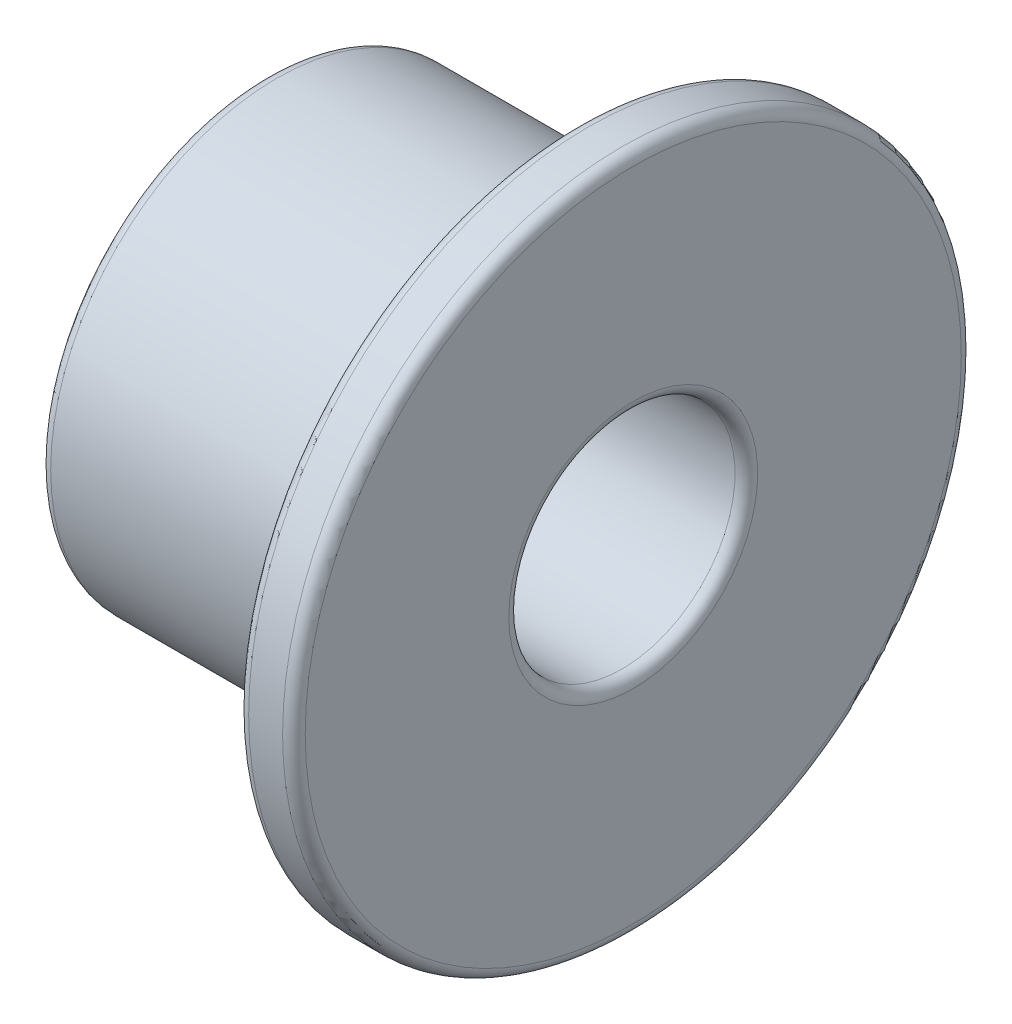
ISO-10303-21;
HEADER;
FILE_DESCRIPTION(('STEP AP214'),'2;1');
FILE_NAME('part.step','',(''),(''),'','','');
FILE_SCHEMA(('AUTOMOTIVE_DESIGN { 1 0 10303 214 1 1 1 1 }'));
ENDSEC;
DATA;
#1=APPLICATION_CONTEXT('core data for automotive mechanical design processes');
#2=APPLICATION_PROTOCOL_DEFINITION('international standard','automotive_design',2000,#1);
#3=PRODUCT_CONTEXT('',#1,'mechanical');
#4=PRODUCT('Part','Part','',(#3));
#5=PRODUCT_RELATED_PRODUCT_CATEGORY('part','',(#4));
#6=PRODUCT_DEFINITION_FORMATION('','',#4);
#7=PRODUCT_DEFINITION_CONTEXT('part definition',#1,'design');
#8=PRODUCT_DEFINITION('design','',#6,#7);
#9=PRODUCT_DEFINITION_SHAPE('','',#8);
#10=(LENGTH_UNIT() NAMED_UNIT(*) SI_UNIT(.MILLI.,.METRE.));
#11=(NAMED_UNIT(*) PLANE_ANGLE_UNIT() SI_UNIT($,.RADIAN.));
#12=(NAMED_UNIT(*) SI_UNIT($,.STERADIAN.) SOLID_ANGLE_UNIT());
#13=UNCERTAINTY_MEASURE_WITH_UNIT(LENGTH_MEASURE(1.E-05),#10,'distance_accuracy_value','');
#14=(GEOMETRIC_REPRESENTATION_CONTEXT(3) GLOBAL_UNCERTAINTY_ASSIGNED_CONTEXT((#13)) GLOBAL_UNIT_ASSIGNED_CONTEXT((#10,
#11,#12)) REPRESENTATION_CONTEXT('',''));
#15=CARTESIAN_POINT('',(0.,0.,0.));
#16=DIRECTION('',(0.,0.,1.));
#17=DIRECTION('',(1.,0.,0.));
#18=AXIS2_PLACEMENT_3D('',#15,#16,#17);
#19=CARTESIAN_POINT('',(0.,4.,0.));
#20=DIRECTION('',(1.,0.,0.));
#21=DIRECTION('',(0.,0.,-1.));
#22=AXIS2_PLACEMENT_3D('',#19,#20,#21);
#23=PLANE('',#22);
#24=CARTESIAN_POINT('',(0.,0.,0.));
#25=DIRECTION('',(1.,0.,0.));
#26=DIRECTION('',(0.,0.,-1.));
#27=AXIS2_PLACEMENT_3D('',#24,#25,#26);
#28=CIRCLE('',#27,2.2);
#29=CARTESIAN_POINT('',(0.,0.,-2.2));
#30=VERTEX_POINT('',#29);
#31=EDGE_CURVE('E62',#30,#30,#28,.T.);
#32=ORIENTED_EDGE('',*,*,#31,.T.);
#33=EDGE_LOOP('',(#32));
#34=FACE_BOUND('',#33,.T.);
#35=CARTESIAN_POINT('',(0.,0.,0.));
#36=DIRECTION('',(1.,0.,0.));
#37=DIRECTION('',(0.,0.,-1.));
#38=AXIS2_PLACEMENT_3D('',#35,#36,#37);
#39=CIRCLE('',#38,3.8);
#40=CARTESIAN_POINT('',(0.,0.,-3.8));
#41=VERTEX_POINT('',#40);
#42=EDGE_CURVE('E65',#41,#41,#39,.F.);
#43=ORIENTED_EDGE('',*,*,#42,.T.);
#44=EDGE_LOOP('',(#43));
#45=FACE_BOUND('',#44,.T.);
#46=ADVANCED_FACE('F31',(#34,#45),#23,.F.);
#47=CARTESIAN_POINT('',(0.,0.,0.));
#48=DIRECTION('',(-1.,0.,0.));
#49=DIRECTION('',(0.,0.,1.));
#50=AXIS2_PLACEMENT_3D('',#47,#48,#49);
#51=CYLINDRICAL_SURFACE('',#50,4.);
#52=CARTESIAN_POINT('',(5.3,0.,0.));
#53=DIRECTION('',(1.,0.,0.));
#54=DIRECTION('',(0.,0.,-1.));
#55=AXIS2_PLACEMENT_3D('',#52,#53,#54);
#56=CIRCLE('',#55,4.);
#57=CARTESIAN_POINT('',(5.3,0.,-4.));
#58=VERTEX_POINT('',#57);
#59=EDGE_CURVE('E50',#58,#58,#56,.F.);
#60=ORIENTED_EDGE('',*,*,#59,.T.);
#61=EDGE_LOOP('',(#60));
#62=FACE_BOUND('',#61,.T.);
#63=CARTESIAN_POINT('',(0.2,0.,0.));
#64=DIRECTION('',(1.,0.,0.));
#65=DIRECTION('',(0.,0.,-1.));
#66=AXIS2_PLACEMENT_3D('',#63,#64,#65);
#67=CIRCLE('',#66,4.);
#68=CARTESIAN_POINT('',(0.2,0.,-4.));
#69=VERTEX_POINT('',#68);
#70=EDGE_CURVE('E53',#69,#69,#67,.T.);
#71=ORIENTED_EDGE('',*,*,#70,.T.);
#72=EDGE_LOOP('',(#71));
#73=FACE_BOUND('',#72,.T.);
#74=ADVANCED_FACE('F107',(#62,#73),#51,.T.);
#75=CARTESIAN_POINT('',(5.5,6.,0.));
#76=DIRECTION('',(1.,0.,0.));
#77=DIRECTION('',(0.,0.,-1.));
#78=AXIS2_PLACEMENT_3D('',#75,#76,#77);
#79=PLANE('',#78);
#80=CARTESIAN_POINT('',(5.5,0.,0.));
#81=DIRECTION('',(1.,0.,0.));
#82=DIRECTION('',(0.,0.,-1.));
#83=AXIS2_PLACEMENT_3D('',#80,#81,#82);
#84=CIRCLE('',#83,4.2);
#85=CARTESIAN_POINT('',(5.5,0.,-4.2));
#86=VERTEX_POINT('',#85);
#87=EDGE_CURVE('E41',#86,#86,#84,.T.);
#88=ORIENTED_EDGE('',*,*,#87,.T.);
#89=EDGE_LOOP('',(#88));
#90=FACE_BOUND('',#89,.T.);
#91=CARTESIAN_POINT('',(5.5,0.,0.));
#92=DIRECTION('',(1.,0.,0.));
#93=DIRECTION('',(0.,0.,-1.));
#94=AXIS2_PLACEMENT_3D('',#91,#92,#93);
#95=CIRCLE('',#94,5.8);
#96=CARTESIAN_POINT('',(5.5,0.,-5.8));
#97=VERTEX_POINT('',#96);
#98=EDGE_CURVE('E45',#97,#97,#95,.F.);
#99=ORIENTED_EDGE('',*,*,#98,.T.);
#100=EDGE_LOOP('',(#99));
#101=FACE_BOUND('',#100,.T.);
#102=ADVANCED_FACE('F112',(#90,#101),#79,.F.);
#103=CARTESIAN_POINT('',(0.,0.,0.));
#104=DIRECTION('',(-1.,0.,0.));
#105=DIRECTION('',(0.,0.,1.));
#106=AXIS2_PLACEMENT_3D('',#103,#104,#105);
#107=CYLINDRICAL_SURFACE('',#106,6.);
#108=CARTESIAN_POINT('',(6.3,0.,0.));
#109=DIRECTION('',(-1.,0.,0.));
#110=DIRECTION('',(0.,0.,1.));
#111=AXIS2_PLACEMENT_3D('',#108,#109,#110);
#112=CIRCLE('',#111,6.);
#113=CARTESIAN_POINT('',(6.3,0.,6.));
#114=VERTEX_POINT('',#113);
#115=EDGE_CURVE('E10',#114,#114,#112,.T.);
#116=ORIENTED_EDGE('',*,*,#115,.T.);
#117=EDGE_LOOP('',(#116));
#118=FACE_BOUND('',#117,.T.);
#119=CARTESIAN_POINT('',(5.7,0.,0.));
#120=DIRECTION('',(1.,0.,0.));
#121=DIRECTION('',(0.,0.,-1.));
#122=AXIS2_PLACEMENT_3D('',#119,#120,#121);
#123=CIRCLE('',#122,6.);
#124=CARTESIAN_POINT('',(5.7,0.,-6.));
#125=VERTEX_POINT('',#124);
#126=EDGE_CURVE('E37',#125,#125,#123,.T.);
#127=ORIENTED_EDGE('',*,*,#126,.T.);
#128=EDGE_LOOP('',(#127));
#129=FACE_BOUND('',#128,.T.);
#130=ADVANCED_FACE('F88',(#118,#129),#107,.T.);
#131=CARTESIAN_POINT('',(6.5,2.,0.));
#132=DIRECTION('',(-1.,0.,0.));
#133=DIRECTION('',(0.,0.,1.));
#134=AXIS2_PLACEMENT_3D('',#131,#132,#133);
#135=PLANE('',#134);
#136=CARTESIAN_POINT('',(6.5,0.,0.));
#137=DIRECTION('',(-1.,0.,0.));
#138=DIRECTION('',(0.,0.,1.));
#139=AXIS2_PLACEMENT_3D('',#136,#137,#138);
#140=CIRCLE('',#139,2.2);
#141=CARTESIAN_POINT('',(6.5,0.,2.2));
#142=VERTEX_POINT('',#141);
#143=EDGE_CURVE('E56',#142,#142,#140,.T.);
#144=ORIENTED_EDGE('',*,*,#143,.T.);
#145=EDGE_LOOP('',(#144));
#146=FACE_BOUND('',#145,.T.);
#147=CARTESIAN_POINT('',(6.5,0.,0.));
#148=DIRECTION('',(-1.,0.,0.));
#149=DIRECTION('',(0.,0.,1.));
#150=AXIS2_PLACEMENT_3D('',#147,#148,#149);
#151=CIRCLE('',#150,5.8);
#152=CARTESIAN_POINT('',(6.5,0.,5.8));
#153=VERTEX_POINT('',#152);
#154=EDGE_CURVE('E59',#153,#153,#151,.F.);
#155=ORIENTED_EDGE('',*,*,#154,.T.);
#156=EDGE_LOOP('',(#155));
#157=FACE_BOUND('',#156,.T.);
#158=ADVANCED_FACE('F85',(#146,#157),#135,.F.);
#159=CARTESIAN_POINT('',(0.,0.,0.));
#160=DIRECTION('',(-1.,0.,0.));
#161=DIRECTION('',(0.,0.,1.));
#162=AXIS2_PLACEMENT_3D('',#159,#160,#161);
#163=CYLINDRICAL_SURFACE('',#162,2.);
#164=CARTESIAN_POINT('',(0.2,0.,0.));
#165=DIRECTION('',(1.,0.,0.));
#166=DIRECTION('',(0.,0.,-1.));
#167=AXIS2_PLACEMENT_3D('',#164,#165,#166);
#168=CIRCLE('',#167,2.);
#169=CARTESIAN_POINT('',(0.2,0.,-2.));
#170=VERTEX_POINT('',#169);
#171=EDGE_CURVE('E68',#170,#170,#168,.F.);
#172=ORIENTED_EDGE('',*,*,#171,.T.);
#173=EDGE_LOOP('',(#172));
#174=FACE_BOUND('',#173,.T.);
#175=CARTESIAN_POINT('',(6.3,0.,0.));
#176=DIRECTION('',(-1.,0.,0.));
#177=DIRECTION('',(0.,0.,1.));
#178=AXIS2_PLACEMENT_3D('',#175,#176,#177);
#179=CIRCLE('',#178,2.);
#180=CARTESIAN_POINT('',(6.3,0.,2.));
#181=VERTEX_POINT('',#180);
#182=EDGE_CURVE('E71',#181,#181,#179,.F.);
#183=ORIENTED_EDGE('',*,*,#182,.T.);
#184=EDGE_LOOP('',(#183));
#185=FACE_BOUND('',#184,.T.);
#186=ADVANCED_FACE('F75',(#174,#185),#163,.F.);
#187=CARTESIAN_POINT('',(0.2,0.,0.));
#188=DIRECTION('',(1.,0.,0.));
#189=DIRECTION('',(0.,0.,-1.));
#190=AXIS2_PLACEMENT_3D('',#187,#188,#189);
#191=TOROIDAL_SURFACE('',#190,2.2,0.2);
#192=ORIENTED_EDGE('',*,*,#31,.F.);
#193=EDGE_LOOP('',(#192));
#194=FACE_BOUND('',#193,.T.);
#195=ORIENTED_EDGE('',*,*,#171,.F.);
#196=EDGE_LOOP('',(#195));
#197=FACE_BOUND('',#196,.T.);
#198=ADVANCED_FACE('F81',(#194,#197),#191,.T.);
#199=CARTESIAN_POINT('',(6.3,0.,0.));
#200=DIRECTION('',(-1.,0.,0.));
#201=DIRECTION('',(0.,0.,1.));
#202=AXIS2_PLACEMENT_3D('',#199,#200,#201);
#203=TOROIDAL_SURFACE('',#202,2.2,0.2);
#204=ORIENTED_EDGE('',*,*,#182,.F.);
#205=EDGE_LOOP('',(#204));
#206=FACE_BOUND('',#205,.T.);
#207=ORIENTED_EDGE('',*,*,#143,.F.);
#208=EDGE_LOOP('',(#207));
#209=FACE_BOUND('',#208,.T.);
#210=ADVANCED_FACE('F77',(#206,#209),#203,.T.);
#211=CARTESIAN_POINT('',(5.3,0.,0.));
#212=DIRECTION('',(1.,0.,0.));
#213=DIRECTION('',(0.,0.,-1.));
#214=AXIS2_PLACEMENT_3D('',#211,#212,#213);
#215=TOROIDAL_SURFACE('',#214,4.2,0.2);
#216=ORIENTED_EDGE('',*,*,#87,.F.);
#217=EDGE_LOOP('',(#216));
#218=FACE_BOUND('',#217,.T.);
#219=ORIENTED_EDGE('',*,*,#59,.F.);
#220=EDGE_LOOP('',(#219));
#221=FACE_BOUND('',#220,.T.);
#222=ADVANCED_FACE('F80',(#218,#221),#215,.F.);
#223=CARTESIAN_POINT('',(0.2,0.,0.));
#224=DIRECTION('',(1.,0.,0.));
#225=DIRECTION('',(0.,0.,-1.));
#226=AXIS2_PLACEMENT_3D('',#223,#224,#225);
#227=TOROIDAL_SURFACE('',#226,3.8,0.2);
#228=ORIENTED_EDGE('',*,*,#70,.F.);
#229=EDGE_LOOP('',(#228));
#230=FACE_BOUND('',#229,.T.);
#231=ORIENTED_EDGE('',*,*,#42,.F.);
#232=EDGE_LOOP('',(#231));
#233=FACE_BOUND('',#232,.T.);
#234=ADVANCED_FACE('F96',(#230,#233),#227,.T.);
#235=CARTESIAN_POINT('',(6.3,0.,0.));
#236=DIRECTION('',(-1.,0.,0.));
#237=DIRECTION('',(0.,0.,1.));
#238=AXIS2_PLACEMENT_3D('',#235,#236,#237);
#239=TOROIDAL_SURFACE('',#238,5.8,0.2);
#240=ORIENTED_EDGE('',*,*,#154,.F.);
#241=EDGE_LOOP('',(#240));
#242=FACE_BOUND('',#241,.T.);
#243=ORIENTED_EDGE('',*,*,#115,.F.);
#244=EDGE_LOOP('',(#243));
#245=FACE_BOUND('',#244,.T.);
#246=ADVANCED_FACE('F92',(#242,#245),#239,.T.);
#247=CARTESIAN_POINT('',(5.7,0.,0.));
#248=DIRECTION('',(1.,0.,0.));
#249=DIRECTION('',(0.,0.,-1.));
#250=AXIS2_PLACEMENT_3D('',#247,#248,#249);
#251=TOROIDAL_SURFACE('',#250,5.8,0.2);
#252=ORIENTED_EDGE('',*,*,#126,.F.);
#253=EDGE_LOOP('',(#252));
#254=FACE_BOUND('',#253,.T.);
#255=ORIENTED_EDGE('',*,*,#98,.F.);
#256=EDGE_LOOP('',(#255));
#257=FACE_BOUND('',#256,.T.);
#258=ADVANCED_FACE('F95',(#254,#257),#251,.T.);
#259=CLOSED_SHELL('',(#46,#74,#102,#130,#158,#186,#198,#210,#222,#234,#246,#258));
#260=MANIFOLD_SOLID_BREP('B2',#259);
#261=ADVANCED_BREP_SHAPE_REPRESENTATION('',(#18,#260),#14);
#262=SHAPE_DEFINITION_REPRESENTATION(#9,#261);
ENDSEC;
END-ISO-10303-21;
